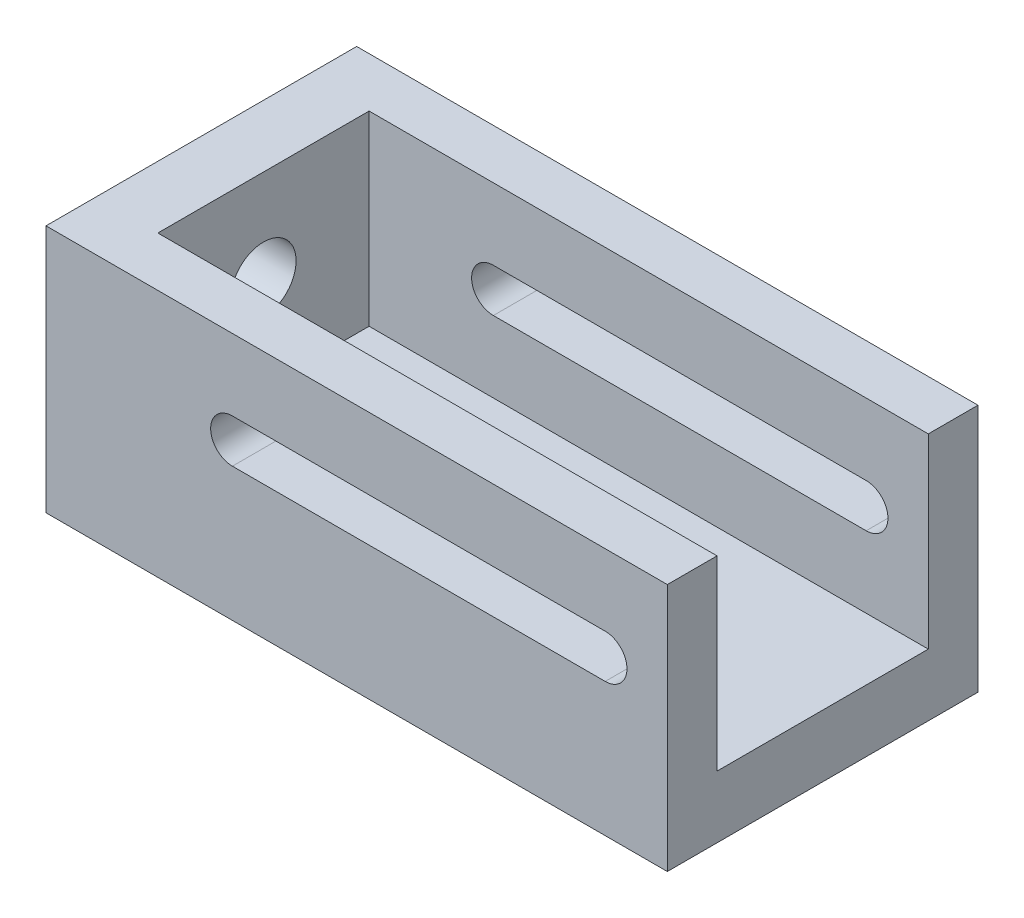
ISO-10303-21;
HEADER;
FILE_DESCRIPTION(('STEP AP214'),'2;1');
FILE_NAME('part.step','',(''),(''),'','','');
FILE_SCHEMA(('AUTOMOTIVE_DESIGN { 1 0 10303 214 1 1 1 1 }'));
ENDSEC;
DATA;
#1=APPLICATION_CONTEXT('core data for automotive mechanical design processes');
#2=APPLICATION_PROTOCOL_DEFINITION('international standard','automotive_design',2000,#1);
#3=PRODUCT_CONTEXT('',#1,'mechanical');
#4=PRODUCT('Part','Part','',(#3));
#5=PRODUCT_RELATED_PRODUCT_CATEGORY('part','',(#4));
#6=PRODUCT_DEFINITION_FORMATION('','',#4);
#7=PRODUCT_DEFINITION_CONTEXT('part definition',#1,'design');
#8=PRODUCT_DEFINITION('design','',#6,#7);
#9=PRODUCT_DEFINITION_SHAPE('','',#8);
#10=(LENGTH_UNIT() NAMED_UNIT(*) SI_UNIT(.MILLI.,.METRE.));
#11=(NAMED_UNIT(*) PLANE_ANGLE_UNIT() SI_UNIT($,.RADIAN.));
#12=(NAMED_UNIT(*) SI_UNIT($,.STERADIAN.) SOLID_ANGLE_UNIT());
#13=UNCERTAINTY_MEASURE_WITH_UNIT(LENGTH_MEASURE(1.E-05),#10,'distance_accuracy_value','');
#14=(GEOMETRIC_REPRESENTATION_CONTEXT(3) GLOBAL_UNCERTAINTY_ASSIGNED_CONTEXT((#13)) GLOBAL_UNIT_ASSIGNED_CONTEXT((#10,
#11,#12)) REPRESENTATION_CONTEXT('',''));
#15=CARTESIAN_POINT('',(0.,0.,0.));
#16=DIRECTION('',(0.,0.,1.));
#17=DIRECTION('',(1.,0.,0.));
#18=AXIS2_PLACEMENT_3D('',#15,#16,#17);
#19=CARTESIAN_POINT('',(0.,10.,0.));
#20=DIRECTION('',(0.,-1.,0.));
#21=DIRECTION('',(0.,0.,-1.));
#22=AXIS2_PLACEMENT_3D('',#19,#20,#21);
#23=PLANE('',#22);
#24=CARTESIAN_POINT('',(-25.,10.,0.));
#25=DIRECTION('',(0.,1.,0.));
#26=DIRECTION('',(0.,0.,1.));
#27=AXIS2_PLACEMENT_3D('',#24,#25,#26);
#28=CIRCLE('',#27,5.);
#29=CARTESIAN_POINT('',(-25.,10.,5.));
#30=VERTEX_POINT('',#29);
#31=EDGE_CURVE('E484',#30,#30,#28,.T.);
#32=ORIENTED_EDGE('',*,*,#31,.F.);
#33=EDGE_LOOP('',(#32));
#34=FACE_BOUND('',#33,.T.);
#35=CARTESIAN_POINT('',(0.,10.,0.));
#36=DIRECTION('',(0.,1.,0.));
#37=DIRECTION('',(0.,0.,1.));
#38=AXIS2_PLACEMENT_3D('',#35,#36,#37);
#39=CIRCLE('',#38,5.);
#40=CARTESIAN_POINT('',(0.,10.,5.));
#41=VERTEX_POINT('',#40);
#42=EDGE_CURVE('E498',#41,#41,#39,.T.);
#43=ORIENTED_EDGE('',*,*,#42,.F.);
#44=EDGE_LOOP('',(#43));
#45=FACE_BOUND('',#44,.T.);
#46=DIRECTION('',(0.,0.,-1.));
#47=VECTOR('',#46,1.);
#48=CARTESIAN_POINT('',(-40.,10.,-17.));
#49=LINE('',#48,#47);
#50=CARTESIAN_POINT('',(-40.,10.,17.));
#51=VERTEX_POINT('',#50);
#52=CARTESIAN_POINT('',(-40.,10.,-17.));
#53=VERTEX_POINT('',#52);
#54=EDGE_CURVE('E252',#51,#53,#49,.T.);
#55=ORIENTED_EDGE('',*,*,#54,.F.);
#56=DIRECTION('',(-1.,0.,0.));
#57=VECTOR('',#56,1.);
#58=CARTESIAN_POINT('',(-50.,10.,17.));
#59=LINE('',#58,#57);
#60=CARTESIAN_POINT('',(50.,10.,17.));
#61=VERTEX_POINT('',#60);
#62=EDGE_CURVE('E279',#61,#51,#59,.T.);
#63=ORIENTED_EDGE('',*,*,#62,.F.);
#64=DIRECTION('',(0.,0.,-1.));
#65=VECTOR('',#64,1.);
#66=CARTESIAN_POINT('',(50.,10.,25.));
#67=LINE('',#66,#65);
#68=CARTESIAN_POINT('',(50.,10.,-17.));
#69=VERTEX_POINT('',#68);
#70=EDGE_CURVE('E303',#61,#69,#67,.T.);
#71=ORIENTED_EDGE('',*,*,#70,.T.);
#72=DIRECTION('',(1.,0.,0.));
#73=VECTOR('',#72,1.);
#74=CARTESIAN_POINT('',(-50.,10.,-17.));
#75=LINE('',#74,#73);
#76=EDGE_CURVE('E261',#53,#69,#75,.T.);
#77=ORIENTED_EDGE('',*,*,#76,.F.);
#78=EDGE_LOOP('',(#55,#63,#71,#77));
#79=FACE_BOUND('',#78,.T.);
#80=ADVANCED_FACE('F39',(#34,#45,#79),#23,.F.);
#81=CARTESIAN_POINT('',(-50.,40.,17.));
#82=DIRECTION('',(0.,0.,1.));
#83=DIRECTION('',(1.,0.,0.));
#84=AXIS2_PLACEMENT_3D('',#81,#82,#83);
#85=PLANE('',#84);
#86=DIRECTION('',(-1.,0.,0.));
#87=VECTOR('',#86,1.);
#88=CARTESIAN_POINT('',(-50.,28.5,17.));
#89=LINE('',#88,#87);
#90=CARTESIAN_POINT('',(40.,28.5,17.));
#91=VERTEX_POINT('',#90);
#92=CARTESIAN_POINT('',(-20.,28.5,17.));
#93=VERTEX_POINT('',#92);
#94=EDGE_CURVE('E233',#91,#93,#89,.T.);
#95=ORIENTED_EDGE('',*,*,#94,.T.);
#96=CARTESIAN_POINT('',(-20.,25.,17.));
#97=DIRECTION('',(0.,0.,1.));
#98=DIRECTION('',(1.,0.,0.));
#99=AXIS2_PLACEMENT_3D('',#96,#97,#98);
#100=CIRCLE('',#99,3.5);
#101=CARTESIAN_POINT('',(-20.,21.5,17.));
#102=VERTEX_POINT('',#101);
#103=EDGE_CURVE('E239',#93,#102,#100,.T.);
#104=ORIENTED_EDGE('',*,*,#103,.T.);
#105=DIRECTION('',(1.,0.,0.));
#106=VECTOR('',#105,1.);
#107=CARTESIAN_POINT('',(-50.,21.5,17.));
#108=LINE('',#107,#106);
#109=CARTESIAN_POINT('',(40.,21.5,17.));
#110=VERTEX_POINT('',#109);
#111=EDGE_CURVE('E217',#102,#110,#108,.T.);
#112=ORIENTED_EDGE('',*,*,#111,.T.);
#113=CARTESIAN_POINT('',(40.,25.,17.));
#114=DIRECTION('',(0.,0.,1.));
#115=DIRECTION('',(1.,0.,0.));
#116=AXIS2_PLACEMENT_3D('',#113,#114,#115);
#117=CIRCLE('',#116,3.5);
#118=EDGE_CURVE('E225',#110,#91,#117,.T.);
#119=ORIENTED_EDGE('',*,*,#118,.T.);
#120=EDGE_LOOP('',(#95,#104,#112,#119));
#121=FACE_BOUND('',#120,.T.);
#122=DIRECTION('',(0.,-1.,0.));
#123=VECTOR('',#122,1.);
#124=CARTESIAN_POINT('',(-40.,40.,17.));
#125=LINE('',#124,#123);
#126=CARTESIAN_POINT('',(-40.,40.,17.));
#127=VERTEX_POINT('',#126);
#128=EDGE_CURVE('E258',#127,#51,#125,.T.);
#129=ORIENTED_EDGE('',*,*,#128,.F.);
#130=DIRECTION('',(-1.,0.,0.));
#131=VECTOR('',#130,1.);
#132=CARTESIAN_POINT('',(-50.,40.,17.));
#133=LINE('',#132,#131);
#134=CARTESIAN_POINT('',(50.,40.,17.));
#135=VERTEX_POINT('',#134);
#136=EDGE_CURVE('E291',#135,#127,#133,.T.);
#137=ORIENTED_EDGE('',*,*,#136,.F.);
#138=DIRECTION('',(0.,-1.,0.));
#139=VECTOR('',#138,1.);
#140=CARTESIAN_POINT('',(50.,40.,17.));
#141=LINE('',#140,#139);
#142=EDGE_CURVE('E295',#135,#61,#141,.T.);
#143=ORIENTED_EDGE('',*,*,#142,.T.);
#144=ORIENTED_EDGE('',*,*,#62,.T.);
#145=EDGE_LOOP('',(#129,#137,#143,#144));
#146=FACE_BOUND('',#145,.T.);
#147=ADVANCED_FACE('F358',(#121,#146),#85,.F.);
#148=CARTESIAN_POINT('',(-50.,40.,-17.));
#149=DIRECTION('',(0.,0.,-1.));
#150=DIRECTION('',(-1.,0.,0.));
#151=AXIS2_PLACEMENT_3D('',#148,#149,#150);
#152=PLANE('',#151);
#153=DIRECTION('',(-1.,0.,0.));
#154=VECTOR('',#153,1.);
#155=CARTESIAN_POINT('',(-50.,21.5,-17.));
#156=LINE('',#155,#154);
#157=CARTESIAN_POINT('',(40.,21.5,-17.));
#158=VERTEX_POINT('',#157);
#159=CARTESIAN_POINT('',(-20.,21.5,-17.));
#160=VERTEX_POINT('',#159);
#161=EDGE_CURVE('E206',#158,#160,#156,.T.);
#162=ORIENTED_EDGE('',*,*,#161,.T.);
#163=CARTESIAN_POINT('',(-20.,25.,-17.));
#164=DIRECTION('',(0.,0.,-1.));
#165=DIRECTION('',(-1.,0.,0.));
#166=AXIS2_PLACEMENT_3D('',#163,#164,#165);
#167=CIRCLE('',#166,3.5);
#168=CARTESIAN_POINT('',(-20.,28.5,-17.));
#169=VERTEX_POINT('',#168);
#170=EDGE_CURVE('E159',#160,#169,#167,.T.);
#171=ORIENTED_EDGE('',*,*,#170,.T.);
#172=DIRECTION('',(1.,0.,0.));
#173=VECTOR('',#172,1.);
#174=CARTESIAN_POINT('',(-50.,28.5,-17.));
#175=LINE('',#174,#173);
#176=CARTESIAN_POINT('',(40.,28.5,-17.));
#177=VERTEX_POINT('',#176);
#178=EDGE_CURVE('E229',#169,#177,#175,.T.);
#179=ORIENTED_EDGE('',*,*,#178,.T.);
#180=CARTESIAN_POINT('',(40.,25.,-17.));
#181=DIRECTION('',(0.,0.,-1.));
#182=DIRECTION('',(-1.,0.,0.));
#183=AXIS2_PLACEMENT_3D('',#180,#181,#182);
#184=CIRCLE('',#183,3.5);
#185=EDGE_CURVE('E221',#177,#158,#184,.T.);
#186=ORIENTED_EDGE('',*,*,#185,.T.);
#187=EDGE_LOOP('',(#162,#171,#179,#186));
#188=FACE_BOUND('',#187,.T.);
#189=DIRECTION('',(0.,-1.,0.));
#190=VECTOR('',#189,1.);
#191=CARTESIAN_POINT('',(-40.,40.,-17.));
#192=LINE('',#191,#190);
#193=CARTESIAN_POINT('',(-40.,40.,-17.));
#194=VERTEX_POINT('',#193);
#195=EDGE_CURVE('E251',#194,#53,#192,.T.);
#196=ORIENTED_EDGE('',*,*,#195,.T.);
#197=ORIENTED_EDGE('',*,*,#76,.T.);
#198=DIRECTION('',(0.,-1.,0.));
#199=VECTOR('',#198,1.);
#200=CARTESIAN_POINT('',(50.,40.,-17.));
#201=LINE('',#200,#199);
#202=CARTESIAN_POINT('',(50.,40.,-17.));
#203=VERTEX_POINT('',#202);
#204=EDGE_CURVE('E273',#203,#69,#201,.T.);
#205=ORIENTED_EDGE('',*,*,#204,.F.);
#206=DIRECTION('',(1.,0.,0.));
#207=VECTOR('',#206,1.);
#208=CARTESIAN_POINT('',(-50.,40.,-17.));
#209=LINE('',#208,#207);
#210=EDGE_CURVE('E262',#194,#203,#209,.T.);
#211=ORIENTED_EDGE('',*,*,#210,.F.);
#212=EDGE_LOOP('',(#196,#197,#205,#211));
#213=FACE_BOUND('',#212,.T.);
#214=ADVANCED_FACE('F352',(#188,#213),#152,.F.);
#215=CARTESIAN_POINT('',(50.,10.,25.));
#216=DIRECTION('',(-1.,0.,0.));
#217=DIRECTION('',(0.,0.,1.));
#218=AXIS2_PLACEMENT_3D('',#215,#216,#217);
#219=PLANE('',#218);
#220=DIRECTION('',(0.,0.,-1.));
#221=VECTOR('',#220,1.);
#222=CARTESIAN_POINT('',(50.,0.,25.));
#223=LINE('',#222,#221);
#224=CARTESIAN_POINT('',(50.,0.,25.));
#225=VERTEX_POINT('',#224);
#226=CARTESIAN_POINT('',(50.,0.,-25.));
#227=VERTEX_POINT('',#226);
#228=EDGE_CURVE('E302',#225,#227,#223,.T.);
#229=ORIENTED_EDGE('',*,*,#228,.T.);
#230=DIRECTION('',(0.,-1.,0.));
#231=VECTOR('',#230,1.);
#232=CARTESIAN_POINT('',(50.,10.,-25.));
#233=LINE('',#232,#231);
#234=CARTESIAN_POINT('',(50.,40.,-25.));
#235=VERTEX_POINT('',#234);
#236=EDGE_CURVE('E11',#235,#227,#233,.T.);
#237=ORIENTED_EDGE('',*,*,#236,.F.);
#238=DIRECTION('',(0.,0.,-1.));
#239=VECTOR('',#238,1.);
#240=CARTESIAN_POINT('',(50.,40.,-25.));
#241=LINE('',#240,#239);
#242=EDGE_CURVE('E265',#203,#235,#241,.T.);
#243=ORIENTED_EDGE('',*,*,#242,.F.);
#244=ORIENTED_EDGE('',*,*,#204,.T.);
#245=ORIENTED_EDGE('',*,*,#70,.F.);
#246=ORIENTED_EDGE('',*,*,#142,.F.);
#247=DIRECTION('',(0.,0.,-1.));
#248=VECTOR('',#247,1.);
#249=CARTESIAN_POINT('',(50.,40.,25.));
#250=LINE('',#249,#248);
#251=CARTESIAN_POINT('',(50.,40.,25.));
#252=VERTEX_POINT('',#251);
#253=EDGE_CURVE('E288',#252,#135,#250,.T.);
#254=ORIENTED_EDGE('',*,*,#253,.F.);
#255=DIRECTION('',(0.,-1.,0.));
#256=VECTOR('',#255,1.);
#257=CARTESIAN_POINT('',(50.,10.,25.));
#258=LINE('',#257,#256);
#259=EDGE_CURVE('E307',#252,#225,#258,.T.);
#260=ORIENTED_EDGE('',*,*,#259,.T.);
#261=EDGE_LOOP('',(#229,#237,#243,#244,#245,#246,#254,#260));
#262=FACE_BOUND('',#261,.T.);
#263=ADVANCED_FACE('F41',(#262),#219,.F.);
#264=CARTESIAN_POINT('',(-50.,10.,-25.));
#265=DIRECTION('',(0.,0.,1.));
#266=DIRECTION('',(1.,0.,0.));
#267=AXIS2_PLACEMENT_3D('',#264,#265,#266);
#268=PLANE('',#267);
#269=DIRECTION('',(-1.,0.,0.));
#270=VECTOR('',#269,1.);
#271=CARTESIAN_POINT('',(-20.,28.5,-25.));
#272=LINE('',#271,#270);
#273=CARTESIAN_POINT('',(40.,28.5,-25.));
#274=VERTEX_POINT('',#273);
#275=CARTESIAN_POINT('',(-20.,28.5,-25.));
#276=VERTEX_POINT('',#275);
#277=EDGE_CURVE('E178',#274,#276,#272,.T.);
#278=ORIENTED_EDGE('',*,*,#277,.T.);
#279=CARTESIAN_POINT('',(-20.,25.,-25.));
#280=DIRECTION('',(0.,0.,1.));
#281=DIRECTION('',(1.,0.,0.));
#282=AXIS2_PLACEMENT_3D('',#279,#280,#281);
#283=CIRCLE('',#282,3.5);
#284=CARTESIAN_POINT('',(-20.,21.5,-25.));
#285=VERTEX_POINT('',#284);
#286=EDGE_CURVE('E156',#276,#285,#283,.T.);
#287=ORIENTED_EDGE('',*,*,#286,.T.);
#288=DIRECTION('',(1.,0.,0.));
#289=VECTOR('',#288,1.);
#290=CARTESIAN_POINT('',(-20.,21.5,-25.));
#291=LINE('',#290,#289);
#292=CARTESIAN_POINT('',(40.,21.5,-25.));
#293=VERTEX_POINT('',#292);
#294=EDGE_CURVE('E166',#285,#293,#291,.T.);
#295=ORIENTED_EDGE('',*,*,#294,.T.);
#296=CARTESIAN_POINT('',(40.,25.,-25.));
#297=DIRECTION('',(0.,0.,1.));
#298=DIRECTION('',(1.,0.,0.));
#299=AXIS2_PLACEMENT_3D('',#296,#297,#298);
#300=CIRCLE('',#299,3.5);
#301=EDGE_CURVE('E173',#293,#274,#300,.T.);
#302=ORIENTED_EDGE('',*,*,#301,.T.);
#303=EDGE_LOOP('',(#278,#287,#295,#302));
#304=FACE_BOUND('',#303,.T.);
#305=DIRECTION('',(-1.,0.,0.));
#306=VECTOR('',#305,1.);
#307=CARTESIAN_POINT('',(-50.,0.,-25.));
#308=LINE('',#307,#306);
#309=CARTESIAN_POINT('',(-50.,0.,-25.));
#310=VERTEX_POINT('',#309);
#311=EDGE_CURVE('E312',#227,#310,#308,.T.);
#312=ORIENTED_EDGE('',*,*,#311,.T.);
#313=DIRECTION('',(0.,-1.,0.));
#314=VECTOR('',#313,1.);
#315=CARTESIAN_POINT('',(-50.,10.,-25.));
#316=LINE('',#315,#314);
#317=CARTESIAN_POINT('',(-50.,40.,-25.));
#318=VERTEX_POINT('',#317);
#319=EDGE_CURVE('E49',#318,#310,#316,.T.);
#320=ORIENTED_EDGE('',*,*,#319,.F.);
#321=DIRECTION('',(-1.,0.,0.));
#322=VECTOR('',#321,1.);
#323=CARTESIAN_POINT('',(-50.,40.,-25.));
#324=LINE('',#323,#322);
#325=EDGE_CURVE('E269',#235,#318,#324,.T.);
#326=ORIENTED_EDGE('',*,*,#325,.F.);
#327=ORIENTED_EDGE('',*,*,#236,.T.);
#328=EDGE_LOOP('',(#312,#320,#326,#327));
#329=FACE_BOUND('',#328,.T.);
#330=ADVANCED_FACE('F175',(#304,#329),#268,.F.);
#331=CARTESIAN_POINT('',(-50.,10.,25.));
#332=DIRECTION('',(1.,0.,0.));
#333=DIRECTION('',(0.,0.,-1.));
#334=AXIS2_PLACEMENT_3D('',#331,#332,#333);
#335=PLANE('',#334);
#336=CARTESIAN_POINT('',(-50.,25.,0.));
#337=DIRECTION('',(-1.,0.,0.));
#338=DIRECTION('',(0.,0.,1.));
#339=AXIS2_PLACEMENT_3D('',#336,#337,#338);
#340=CIRCLE('',#339,5.25);
#341=CARTESIAN_POINT('',(-50.,25.,5.25));
#342=VERTEX_POINT('',#341);
#343=EDGE_CURVE('E243',#342,#342,#340,.T.);
#344=ORIENTED_EDGE('',*,*,#343,.F.);
#345=EDGE_LOOP('',(#344));
#346=FACE_BOUND('',#345,.T.);
#347=DIRECTION('',(0.,0.,1.));
#348=VECTOR('',#347,1.);
#349=CARTESIAN_POINT('',(-50.,0.,25.));
#350=LINE('',#349,#348);
#351=CARTESIAN_POINT('',(-50.,0.,25.));
#352=VERTEX_POINT('',#351);
#353=EDGE_CURVE('E315',#310,#352,#350,.T.);
#354=ORIENTED_EDGE('',*,*,#353,.T.);
#355=DIRECTION('',(0.,-1.,0.));
#356=VECTOR('',#355,1.);
#357=CARTESIAN_POINT('',(-50.,10.,25.));
#358=LINE('',#357,#356);
#359=CARTESIAN_POINT('',(-50.,40.,25.));
#360=VERTEX_POINT('',#359);
#361=EDGE_CURVE('E323',#360,#352,#358,.T.);
#362=ORIENTED_EDGE('',*,*,#361,.F.);
#363=DIRECTION('',(0.,0.,1.));
#364=VECTOR('',#363,1.);
#365=CARTESIAN_POINT('',(-50.,40.,25.));
#366=LINE('',#365,#364);
#367=EDGE_CURVE('E280',#318,#360,#366,.T.);
#368=ORIENTED_EDGE('',*,*,#367,.F.);
#369=ORIENTED_EDGE('',*,*,#319,.T.);
#370=EDGE_LOOP('',(#354,#362,#368,#369));
#371=FACE_BOUND('',#370,.T.);
#372=ADVANCED_FACE('F332',(#346,#371),#335,.F.);
#373=CARTESIAN_POINT('',(-50.,10.,25.));
#374=DIRECTION('',(0.,0.,-1.));
#375=DIRECTION('',(-1.,0.,0.));
#376=AXIS2_PLACEMENT_3D('',#373,#374,#375);
#377=PLANE('',#376);
#378=DIRECTION('',(1.,0.,0.));
#379=VECTOR('',#378,1.);
#380=CARTESIAN_POINT('',(-20.,21.5,25.));
#381=LINE('',#380,#379);
#382=CARTESIAN_POINT('',(-20.,21.5,25.));
#383=VERTEX_POINT('',#382);
#384=CARTESIAN_POINT('',(40.,21.5,25.));
#385=VERTEX_POINT('',#384);
#386=EDGE_CURVE('E197',#383,#385,#381,.T.);
#387=ORIENTED_EDGE('',*,*,#386,.F.);
#388=CARTESIAN_POINT('',(-20.,25.,25.));
#389=DIRECTION('',(0.,0.,1.));
#390=DIRECTION('',(1.,0.,0.));
#391=AXIS2_PLACEMENT_3D('',#388,#389,#390);
#392=CIRCLE('',#391,3.5);
#393=CARTESIAN_POINT('',(-20.,28.5,25.));
#394=VERTEX_POINT('',#393);
#395=EDGE_CURVE('E194',#394,#383,#392,.T.);
#396=ORIENTED_EDGE('',*,*,#395,.F.);
#397=DIRECTION('',(-1.,0.,0.));
#398=VECTOR('',#397,1.);
#399=CARTESIAN_POINT('',(-20.,28.5,25.));
#400=LINE('',#399,#398);
#401=CARTESIAN_POINT('',(40.,28.5,25.));
#402=VERTEX_POINT('',#401);
#403=EDGE_CURVE('E180',#402,#394,#400,.T.);
#404=ORIENTED_EDGE('',*,*,#403,.F.);
#405=CARTESIAN_POINT('',(40.,25.,25.));
#406=DIRECTION('',(0.,0.,1.));
#407=DIRECTION('',(1.,0.,0.));
#408=AXIS2_PLACEMENT_3D('',#405,#406,#407);
#409=CIRCLE('',#408,3.5);
#410=EDGE_CURVE('E184',#385,#402,#409,.T.);
#411=ORIENTED_EDGE('',*,*,#410,.F.);
#412=EDGE_LOOP('',(#387,#396,#404,#411));
#413=FACE_BOUND('',#412,.T.);
#414=DIRECTION('',(1.,0.,0.));
#415=VECTOR('',#414,1.);
#416=CARTESIAN_POINT('',(-50.,0.,25.));
#417=LINE('',#416,#415);
#418=EDGE_CURVE('E308',#352,#225,#417,.T.);
#419=ORIENTED_EDGE('',*,*,#418,.T.);
#420=ORIENTED_EDGE('',*,*,#259,.F.);
#421=DIRECTION('',(1.,0.,0.));
#422=VECTOR('',#421,1.);
#423=CARTESIAN_POINT('',(-50.,40.,25.));
#424=LINE('',#423,#422);
#425=EDGE_CURVE('E284',#360,#252,#424,.T.);
#426=ORIENTED_EDGE('',*,*,#425,.F.);
#427=ORIENTED_EDGE('',*,*,#361,.T.);
#428=EDGE_LOOP('',(#419,#420,#426,#427));
#429=FACE_BOUND('',#428,.T.);
#430=ADVANCED_FACE('F339',(#413,#429),#377,.F.);
#431=CARTESIAN_POINT('',(0.,0.,0.));
#432=DIRECTION('',(0.,-1.,0.));
#433=DIRECTION('',(0.,0.,-1.));
#434=AXIS2_PLACEMENT_3D('',#431,#432,#433);
#435=PLANE('',#434);
#436=CARTESIAN_POINT('',(-25.,0.,0.));
#437=DIRECTION('',(0.,1.,0.));
#438=DIRECTION('',(0.,0.,1.));
#439=AXIS2_PLACEMENT_3D('',#436,#437,#438);
#440=CIRCLE('',#439,2.75);
#441=CARTESIAN_POINT('',(-25.,0.,2.75));
#442=VERTEX_POINT('',#441);
#443=EDGE_CURVE('E494',#442,#442,#440,.T.);
#444=ORIENTED_EDGE('',*,*,#443,.T.);
#445=EDGE_LOOP('',(#444));
#446=FACE_BOUND('',#445,.T.);
#447=CARTESIAN_POINT('',(0.,0.,0.));
#448=DIRECTION('',(0.,1.,0.));
#449=DIRECTION('',(0.,0.,1.));
#450=AXIS2_PLACEMENT_3D('',#447,#448,#449);
#451=CIRCLE('',#450,2.75);
#452=CARTESIAN_POINT('',(0.,0.,2.75));
#453=VERTEX_POINT('',#452);
#454=EDGE_CURVE('E187',#453,#453,#451,.T.);
#455=ORIENTED_EDGE('',*,*,#454,.T.);
#456=EDGE_LOOP('',(#455));
#457=FACE_BOUND('',#456,.T.);
#458=ORIENTED_EDGE('',*,*,#228,.F.);
#459=ORIENTED_EDGE('',*,*,#418,.F.);
#460=ORIENTED_EDGE('',*,*,#353,.F.);
#461=ORIENTED_EDGE('',*,*,#311,.F.);
#462=EDGE_LOOP('',(#458,#459,#460,#461));
#463=FACE_BOUND('',#462,.T.);
#464=ADVANCED_FACE('F337',(#446,#457,#463),#435,.T.);
#465=CARTESIAN_POINT('',(0.,40.,0.));
#466=DIRECTION('',(0.,-1.,0.));
#467=DIRECTION('',(0.,0.,-1.));
#468=AXIS2_PLACEMENT_3D('',#465,#466,#467);
#469=PLANE('',#468);
#470=ORIENTED_EDGE('',*,*,#367,.T.);
#471=ORIENTED_EDGE('',*,*,#425,.T.);
#472=ORIENTED_EDGE('',*,*,#253,.T.);
#473=ORIENTED_EDGE('',*,*,#136,.T.);
#474=DIRECTION('',(0.,0.,-1.));
#475=VECTOR('',#474,1.);
#476=CARTESIAN_POINT('',(-40.,40.,-17.));
#477=LINE('',#476,#475);
#478=EDGE_CURVE('E247',#127,#194,#477,.T.);
#479=ORIENTED_EDGE('',*,*,#478,.T.);
#480=ORIENTED_EDGE('',*,*,#210,.T.);
#481=ORIENTED_EDGE('',*,*,#242,.T.);
#482=ORIENTED_EDGE('',*,*,#325,.T.);
#483=EDGE_LOOP('',(#470,#471,#472,#473,#479,#480,#481,#482));
#484=FACE_BOUND('',#483,.T.);
#485=ADVANCED_FACE('F347',(#484),#469,.F.);
#486=CARTESIAN_POINT('',(-40.,40.,-17.));
#487=DIRECTION('',(-1.,0.,0.));
#488=DIRECTION('',(0.,0.,1.));
#489=AXIS2_PLACEMENT_3D('',#486,#487,#488);
#490=PLANE('',#489);
#491=CARTESIAN_POINT('',(-40.,25.,0.));
#492=DIRECTION('',(-1.,0.,0.));
#493=DIRECTION('',(0.,0.,1.));
#494=AXIS2_PLACEMENT_3D('',#491,#492,#493);
#495=CIRCLE('',#494,5.25);
#496=CARTESIAN_POINT('',(-40.,25.,5.25));
#497=VERTEX_POINT('',#496);
#498=EDGE_CURVE('E43',#497,#497,#495,.T.);
#499=ORIENTED_EDGE('',*,*,#498,.T.);
#500=EDGE_LOOP('',(#499));
#501=FACE_BOUND('',#500,.T.);
#502=ORIENTED_EDGE('',*,*,#54,.T.);
#503=ORIENTED_EDGE('',*,*,#195,.F.);
#504=ORIENTED_EDGE('',*,*,#478,.F.);
#505=ORIENTED_EDGE('',*,*,#128,.T.);
#506=EDGE_LOOP('',(#502,#503,#504,#505));
#507=FACE_BOUND('',#506,.T.);
#508=ADVANCED_FACE('F360',(#501,#507),#490,.F.);
#509=CARTESIAN_POINT('',(50.,25.,0.));
#510=DIRECTION('',(-1.,0.,0.));
#511=DIRECTION('',(0.,0.,1.));
#512=AXIS2_PLACEMENT_3D('',#509,#510,#511);
#513=CYLINDRICAL_SURFACE('',#512,5.25);
#514=ORIENTED_EDGE('',*,*,#343,.T.);
#515=EDGE_LOOP('',(#514));
#516=FACE_BOUND('',#515,.T.);
#517=ORIENTED_EDGE('',*,*,#498,.F.);
#518=EDGE_LOOP('',(#517));
#519=FACE_BOUND('',#518,.T.);
#520=ADVANCED_FACE('F362',(#516,#519),#513,.F.);
#521=CARTESIAN_POINT('',(-20.,21.5,-25.));
#522=DIRECTION('',(0.,-1.,0.));
#523=DIRECTION('',(1.,0.,0.));
#524=AXIS2_PLACEMENT_3D('',#521,#522,#523);
#525=PLANE('',#524);
#526=DIRECTION('',(0.,0.,1.));
#527=VECTOR('',#526,1.);
#528=CARTESIAN_POINT('',(-20.,21.5,-25.));
#529=LINE('',#528,#527);
#530=EDGE_CURVE('E162',#102,#383,#529,.T.);
#531=ORIENTED_EDGE('',*,*,#530,.T.);
#532=ORIENTED_EDGE('',*,*,#386,.T.);
#533=DIRECTION('',(0.,0.,1.));
#534=VECTOR('',#533,1.);
#535=CARTESIAN_POINT('',(40.,21.5,-25.));
#536=LINE('',#535,#534);
#537=EDGE_CURVE('E56',#110,#385,#536,.T.);
#538=ORIENTED_EDGE('',*,*,#537,.F.);
#539=ORIENTED_EDGE('',*,*,#111,.F.);
#540=EDGE_LOOP('',(#531,#532,#538,#539));
#541=FACE_BOUND('',#540,.T.);
#542=ADVANCED_FACE('F369',(#541),#525,.F.);
#543=CARTESIAN_POINT('',(40.,25.,-25.));
#544=DIRECTION('',(0.,0.,1.));
#545=DIRECTION('',(1.,0.,0.));
#546=AXIS2_PLACEMENT_3D('',#543,#544,#545);
#547=CYLINDRICAL_SURFACE('',#546,3.5);
#548=ORIENTED_EDGE('',*,*,#537,.T.);
#549=ORIENTED_EDGE('',*,*,#410,.T.);
#550=DIRECTION('',(0.,0.,1.));
#551=VECTOR('',#550,1.);
#552=CARTESIAN_POINT('',(40.,28.5,-25.));
#553=LINE('',#552,#551);
#554=EDGE_CURVE('E212',#91,#402,#553,.T.);
#555=ORIENTED_EDGE('',*,*,#554,.F.);
#556=ORIENTED_EDGE('',*,*,#118,.F.);
#557=EDGE_LOOP('',(#548,#549,#555,#556));
#558=FACE_BOUND('',#557,.T.);
#559=ADVANCED_FACE('F416',(#558),#547,.F.);
#560=CARTESIAN_POINT('',(-20.,28.5,-25.));
#561=DIRECTION('',(0.,1.,0.));
#562=DIRECTION('',(0.,0.,1.));
#563=AXIS2_PLACEMENT_3D('',#560,#561,#562);
#564=PLANE('',#563);
#565=ORIENTED_EDGE('',*,*,#554,.T.);
#566=ORIENTED_EDGE('',*,*,#403,.T.);
#567=DIRECTION('',(0.,0.,1.));
#568=VECTOR('',#567,1.);
#569=CARTESIAN_POINT('',(-20.,28.5,-25.));
#570=LINE('',#569,#568);
#571=EDGE_CURVE('E207',#93,#394,#570,.T.);
#572=ORIENTED_EDGE('',*,*,#571,.F.);
#573=ORIENTED_EDGE('',*,*,#94,.F.);
#574=EDGE_LOOP('',(#565,#566,#572,#573));
#575=FACE_BOUND('',#574,.T.);
#576=ADVANCED_FACE('F410',(#575),#564,.F.);
#577=CARTESIAN_POINT('',(-20.,25.,-25.));
#578=DIRECTION('',(0.,0.,1.));
#579=DIRECTION('',(1.,0.,0.));
#580=AXIS2_PLACEMENT_3D('',#577,#578,#579);
#581=CYLINDRICAL_SURFACE('',#580,3.5);
#582=ORIENTED_EDGE('',*,*,#571,.T.);
#583=ORIENTED_EDGE('',*,*,#395,.T.);
#584=ORIENTED_EDGE('',*,*,#530,.F.);
#585=ORIENTED_EDGE('',*,*,#103,.F.);
#586=EDGE_LOOP('',(#582,#583,#584,#585));
#587=FACE_BOUND('',#586,.T.);
#588=ADVANCED_FACE('F417',(#587),#581,.F.);
#589=EDGE_CURVE('E64',#285,#160,#529,.T.);
#590=ORIENTED_EDGE('',*,*,#589,.F.);
#591=ORIENTED_EDGE('',*,*,#286,.F.);
#592=EDGE_CURVE('E203',#276,#169,#570,.T.);
#593=ORIENTED_EDGE('',*,*,#592,.T.);
#594=ORIENTED_EDGE('',*,*,#170,.F.);
#595=EDGE_LOOP('',(#590,#591,#593,#594));
#596=FACE_BOUND('',#595,.T.);
#597=ADVANCED_FACE('F153',(#596),#581,.F.);
#598=ORIENTED_EDGE('',*,*,#592,.F.);
#599=ORIENTED_EDGE('',*,*,#277,.F.);
#600=EDGE_CURVE('E208',#274,#177,#553,.T.);
#601=ORIENTED_EDGE('',*,*,#600,.T.);
#602=ORIENTED_EDGE('',*,*,#178,.F.);
#603=EDGE_LOOP('',(#598,#599,#601,#602));
#604=FACE_BOUND('',#603,.T.);
#605=ADVANCED_FACE('F407',(#604),#564,.F.);
#606=ORIENTED_EDGE('',*,*,#600,.F.);
#607=ORIENTED_EDGE('',*,*,#301,.F.);
#608=EDGE_CURVE('E169',#293,#158,#536,.T.);
#609=ORIENTED_EDGE('',*,*,#608,.T.);
#610=ORIENTED_EDGE('',*,*,#185,.F.);
#611=EDGE_LOOP('',(#606,#607,#609,#610));
#612=FACE_BOUND('',#611,.T.);
#613=ADVANCED_FACE('F405',(#612),#547,.F.);
#614=ORIENTED_EDGE('',*,*,#608,.F.);
#615=ORIENTED_EDGE('',*,*,#294,.F.);
#616=ORIENTED_EDGE('',*,*,#589,.T.);
#617=ORIENTED_EDGE('',*,*,#161,.F.);
#618=EDGE_LOOP('',(#614,#615,#616,#617));
#619=FACE_BOUND('',#618,.T.);
#620=ADVANCED_FACE('F167',(#619),#525,.F.);
#621=CARTESIAN_POINT('',(0.,10.,0.));
#622=DIRECTION('',(0.,1.,0.));
#623=DIRECTION('',(0.,0.,1.));
#624=AXIS2_PLACEMENT_3D('',#621,#622,#623);
#625=CYLINDRICAL_SURFACE('',#624,2.75);
#626=ORIENTED_EDGE('',*,*,#454,.F.);
#627=EDGE_LOOP('',(#626));
#628=FACE_BOUND('',#627,.T.);
#629=CARTESIAN_POINT('',(0.,5.,0.));
#630=DIRECTION('',(0.,1.,0.));
#631=DIRECTION('',(0.,0.,1.));
#632=AXIS2_PLACEMENT_3D('',#629,#630,#631);
#633=CIRCLE('',#632,2.75);
#634=CARTESIAN_POINT('',(0.,5.,2.75));
#635=VERTEX_POINT('',#634);
#636=EDGE_CURVE('E505',#635,#635,#633,.T.);
#637=ORIENTED_EDGE('',*,*,#636,.T.);
#638=EDGE_LOOP('',(#637));
#639=FACE_BOUND('',#638,.T.);
#640=ADVANCED_FACE('F448',(#628,#639),#625,.F.);
#641=CARTESIAN_POINT('',(2.75,5.,0.));
#642=DIRECTION('',(0.,-1.,0.));
#643=DIRECTION('',(0.,0.,-1.));
#644=AXIS2_PLACEMENT_3D('',#641,#642,#643);
#645=PLANE('',#644);
#646=ORIENTED_EDGE('',*,*,#636,.F.);
#647=EDGE_LOOP('',(#646));
#648=FACE_BOUND('',#647,.T.);
#649=CARTESIAN_POINT('',(0.,5.,0.));
#650=DIRECTION('',(0.,1.,0.));
#651=DIRECTION('',(0.,0.,1.));
#652=AXIS2_PLACEMENT_3D('',#649,#650,#651);
#653=CIRCLE('',#652,5.);
#654=CARTESIAN_POINT('',(0.,5.,5.));
#655=VERTEX_POINT('',#654);
#656=EDGE_CURVE('E502',#655,#655,#653,.T.);
#657=ORIENTED_EDGE('',*,*,#656,.T.);
#658=EDGE_LOOP('',(#657));
#659=FACE_BOUND('',#658,.T.);
#660=ADVANCED_FACE('F452',(#648,#659),#645,.F.);
#661=CARTESIAN_POINT('',(0.,10.,0.));
#662=DIRECTION('',(0.,1.,0.));
#663=DIRECTION('',(0.,0.,1.));
#664=AXIS2_PLACEMENT_3D('',#661,#662,#663);
#665=CYLINDRICAL_SURFACE('',#664,5.);
#666=ORIENTED_EDGE('',*,*,#656,.F.);
#667=EDGE_LOOP('',(#666));
#668=FACE_BOUND('',#667,.T.);
#669=ORIENTED_EDGE('',*,*,#42,.T.);
#670=EDGE_LOOP('',(#669));
#671=FACE_BOUND('',#670,.T.);
#672=ADVANCED_FACE('F457',(#668,#671),#665,.F.);
#673=CARTESIAN_POINT('',(-25.,10.,0.));
#674=DIRECTION('',(0.,1.,0.));
#675=DIRECTION('',(0.,0.,1.));
#676=AXIS2_PLACEMENT_3D('',#673,#674,#675);
#677=CYLINDRICAL_SURFACE('',#676,2.75);
#678=ORIENTED_EDGE('',*,*,#443,.F.);
#679=EDGE_LOOP('',(#678));
#680=FACE_BOUND('',#679,.T.);
#681=CARTESIAN_POINT('',(-25.,5.,0.));
#682=DIRECTION('',(0.,1.,0.));
#683=DIRECTION('',(0.,0.,1.));
#684=AXIS2_PLACEMENT_3D('',#681,#682,#683);
#685=CIRCLE('',#684,2.75);
#686=CARTESIAN_POINT('',(-25.,5.,2.75));
#687=VERTEX_POINT('',#686);
#688=EDGE_CURVE('E488',#687,#687,#685,.T.);
#689=ORIENTED_EDGE('',*,*,#688,.T.);
#690=EDGE_LOOP('',(#689));
#691=FACE_BOUND('',#690,.T.);
#692=ADVANCED_FACE('F465',(#680,#691),#677,.F.);
#693=CARTESIAN_POINT('',(-22.25,5.,0.));
#694=DIRECTION('',(0.,-1.,0.));
#695=DIRECTION('',(0.,0.,-1.));
#696=AXIS2_PLACEMENT_3D('',#693,#694,#695);
#697=PLANE('',#696);
#698=ORIENTED_EDGE('',*,*,#688,.F.);
#699=EDGE_LOOP('',(#698));
#700=FACE_BOUND('',#699,.T.);
#701=CARTESIAN_POINT('',(-25.,5.,0.));
#702=DIRECTION('',(0.,1.,0.));
#703=DIRECTION('',(0.,0.,1.));
#704=AXIS2_PLACEMENT_3D('',#701,#702,#703);
#705=CIRCLE('',#704,5.);
#706=CARTESIAN_POINT('',(-25.,5.,5.));
#707=VERTEX_POINT('',#706);
#708=EDGE_CURVE('E482',#707,#707,#705,.T.);
#709=ORIENTED_EDGE('',*,*,#708,.T.);
#710=EDGE_LOOP('',(#709));
#711=FACE_BOUND('',#710,.T.);
#712=ADVANCED_FACE('F469',(#700,#711),#697,.F.);
#713=CARTESIAN_POINT('',(-25.,10.,0.));
#714=DIRECTION('',(0.,1.,0.));
#715=DIRECTION('',(0.,0.,1.));
#716=AXIS2_PLACEMENT_3D('',#713,#714,#715);
#717=CYLINDRICAL_SURFACE('',#716,5.);
#718=ORIENTED_EDGE('',*,*,#708,.F.);
#719=EDGE_LOOP('',(#718));
#720=FACE_BOUND('',#719,.T.);
#721=ORIENTED_EDGE('',*,*,#31,.T.);
#722=EDGE_LOOP('',(#721));
#723=FACE_BOUND('',#722,.T.);
#724=ADVANCED_FACE('F473',(#720,#723),#717,.F.);
#725=CLOSED_SHELL('',(#80,#147,#214,#263,#330,#372,#430,#464,#485,#508,#520,#542,#559,#576,#588,
#597,#605,#613,#620,#640,#660,#672,#692,#712,#724));
#726=MANIFOLD_SOLID_BREP('B2',#725);
#727=ADVANCED_BREP_SHAPE_REPRESENTATION('',(#18,#726),#14);
#728=SHAPE_DEFINITION_REPRESENTATION(#9,#727);
ENDSEC;
END-ISO-10303-21;
